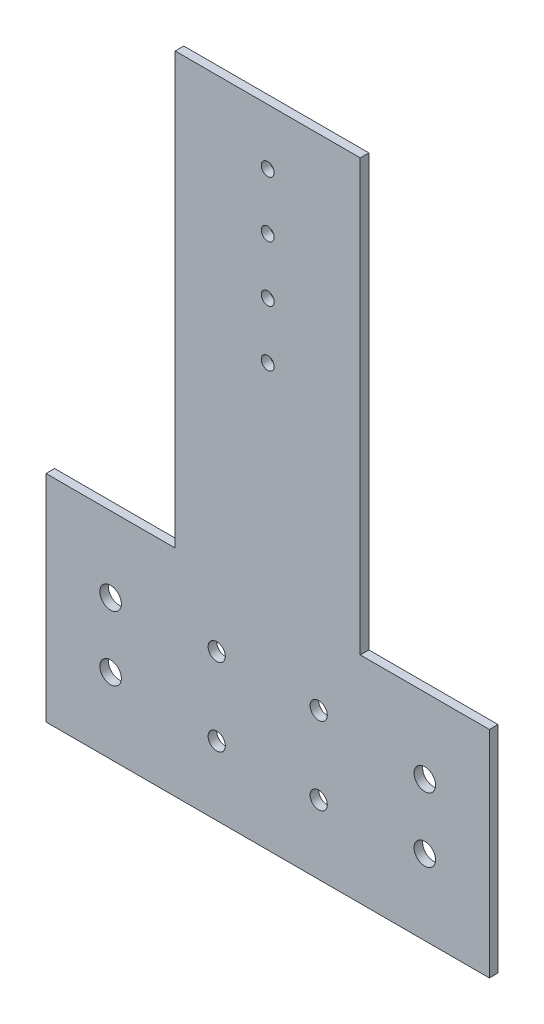
ISO-10303-21;
HEADER;
FILE_DESCRIPTION(('STEP AP214'),'2;1');
FILE_NAME('part.step','',(''),(''),'','','');
FILE_SCHEMA(('AUTOMOTIVE_DESIGN { 1 0 10303 214 1 1 1 1 }'));
ENDSEC;
DATA;
#1=APPLICATION_CONTEXT('core data for automotive mechanical design processes');
#2=APPLICATION_PROTOCOL_DEFINITION('international standard','automotive_design',2000,#1);
#3=PRODUCT_CONTEXT('',#1,'mechanical');
#4=PRODUCT('Part','Part','',(#3));
#5=PRODUCT_RELATED_PRODUCT_CATEGORY('part','',(#4));
#6=PRODUCT_DEFINITION_FORMATION('','',#4);
#7=PRODUCT_DEFINITION_CONTEXT('part definition',#1,'design');
#8=PRODUCT_DEFINITION('design','',#6,#7);
#9=PRODUCT_DEFINITION_SHAPE('','',#8);
#10=(LENGTH_UNIT() NAMED_UNIT(*) SI_UNIT(.MILLI.,.METRE.));
#11=(NAMED_UNIT(*) PLANE_ANGLE_UNIT() SI_UNIT($,.RADIAN.));
#12=(NAMED_UNIT(*) SI_UNIT($,.STERADIAN.) SOLID_ANGLE_UNIT());
#13=UNCERTAINTY_MEASURE_WITH_UNIT(LENGTH_MEASURE(1.E-05),#10,'distance_accuracy_value','');
#14=(GEOMETRIC_REPRESENTATION_CONTEXT(3) GLOBAL_UNCERTAINTY_ASSIGNED_CONTEXT((#13)) GLOBAL_UNIT_ASSIGNED_CONTEXT((#10,
#11,#12)) REPRESENTATION_CONTEXT('',''));
#15=CARTESIAN_POINT('',(0.,0.,0.));
#16=DIRECTION('',(0.,0.,1.));
#17=DIRECTION('',(1.,0.,0.));
#18=AXIS2_PLACEMENT_3D('',#15,#16,#17);
#19=CARTESIAN_POINT('',(-51.5,25.,2.));
#20=DIRECTION('',(0.,-1.,0.));
#21=DIRECTION('',(0.,0.,-1.));
#22=AXIS2_PLACEMENT_3D('',#19,#20,#21);
#23=PLANE('',#22);
#24=DIRECTION('',(0.,0.,1.));
#25=VECTOR('',#24,1.);
#26=CARTESIAN_POINT('',(-21.5,25.,2.));
#27=LINE('',#26,#25);
#28=CARTESIAN_POINT('',(-21.5,25.,0.));
#29=VERTEX_POINT('',#28);
#30=CARTESIAN_POINT('',(-21.5,25.,2.));
#31=VERTEX_POINT('',#30);
#32=EDGE_CURVE('E126',#29,#31,#27,.T.);
#33=ORIENTED_EDGE('',*,*,#32,.F.);
#34=DIRECTION('',(-1.,0.,0.));
#35=VECTOR('',#34,1.);
#36=CARTESIAN_POINT('',(-51.5,25.,0.));
#37=LINE('',#36,#35);
#38=CARTESIAN_POINT('',(-51.5,25.,0.));
#39=VERTEX_POINT('',#38);
#40=EDGE_CURVE('E172',#29,#39,#37,.T.);
#41=ORIENTED_EDGE('',*,*,#40,.T.);
#42=DIRECTION('',(0.,0.,-1.));
#43=VECTOR('',#42,1.);
#44=CARTESIAN_POINT('',(-51.5,25.,2.));
#45=LINE('',#44,#43);
#46=CARTESIAN_POINT('',(-51.5,25.,2.));
#47=VERTEX_POINT('',#46);
#48=EDGE_CURVE('E46',#47,#39,#45,.T.);
#49=ORIENTED_EDGE('',*,*,#48,.F.);
#50=DIRECTION('',(-1.,0.,0.));
#51=VECTOR('',#50,1.);
#52=CARTESIAN_POINT('',(-51.5,25.,2.));
#53=LINE('',#52,#51);
#54=EDGE_CURVE('E54',#31,#47,#53,.T.);
#55=ORIENTED_EDGE('',*,*,#54,.F.);
#56=EDGE_LOOP('',(#33,#41,#49,#55));
#57=FACE_BOUND('',#56,.T.);
#58=ADVANCED_FACE('F37',(#57),#23,.F.);
#59=DIRECTION('',(0.,0.,-1.));
#60=VECTOR('',#59,1.);
#61=CARTESIAN_POINT('',(21.5,25.,2.));
#62=LINE('',#61,#60);
#63=CARTESIAN_POINT('',(21.5,25.,2.));
#64=VERTEX_POINT('',#63);
#65=CARTESIAN_POINT('',(21.5,25.,0.));
#66=VERTEX_POINT('',#65);
#67=EDGE_CURVE('E62',#64,#66,#62,.T.);
#68=ORIENTED_EDGE('',*,*,#67,.F.);
#69=CARTESIAN_POINT('',(51.5,25.,2.));
#70=VERTEX_POINT('',#69);
#71=EDGE_CURVE('E162',#70,#64,#53,.T.);
#72=ORIENTED_EDGE('',*,*,#71,.F.);
#73=DIRECTION('',(0.,0.,-1.));
#74=VECTOR('',#73,1.);
#75=CARTESIAN_POINT('',(51.5,25.,2.));
#76=LINE('',#75,#74);
#77=CARTESIAN_POINT('',(51.5,25.,0.));
#78=VERTEX_POINT('',#77);
#79=EDGE_CURVE('E11',#70,#78,#76,.T.);
#80=ORIENTED_EDGE('',*,*,#79,.T.);
#81=EDGE_CURVE('E174',#78,#66,#37,.T.);
#82=ORIENTED_EDGE('',*,*,#81,.T.);
#83=EDGE_LOOP('',(#68,#72,#80,#82));
#84=FACE_BOUND('',#83,.T.);
#85=ADVANCED_FACE('F289',(#84),#23,.F.);
#86=CARTESIAN_POINT('',(51.5,-25.,2.));
#87=DIRECTION('',(-1.,0.,0.));
#88=DIRECTION('',(0.,0.,1.));
#89=AXIS2_PLACEMENT_3D('',#86,#87,#88);
#90=PLANE('',#89);
#91=DIRECTION('',(0.,1.,0.));
#92=VECTOR('',#91,1.);
#93=CARTESIAN_POINT('',(51.5,-25.,0.));
#94=LINE('',#93,#92);
#95=CARTESIAN_POINT('',(51.5,-25.,0.));
#96=VERTEX_POINT('',#95);
#97=EDGE_CURVE('E169',#96,#78,#94,.T.);
#98=ORIENTED_EDGE('',*,*,#97,.T.);
#99=ORIENTED_EDGE('',*,*,#79,.F.);
#100=DIRECTION('',(0.,1.,0.));
#101=VECTOR('',#100,1.);
#102=CARTESIAN_POINT('',(51.5,-25.,2.));
#103=LINE('',#102,#101);
#104=CARTESIAN_POINT('',(51.5,-25.,2.));
#105=VERTEX_POINT('',#104);
#106=EDGE_CURVE('E159',#105,#70,#103,.T.);
#107=ORIENTED_EDGE('',*,*,#106,.F.);
#108=DIRECTION('',(0.,0.,-1.));
#109=VECTOR('',#108,1.);
#110=CARTESIAN_POINT('',(51.5,-25.,2.));
#111=LINE('',#110,#109);
#112=EDGE_CURVE('E168',#105,#96,#111,.T.);
#113=ORIENTED_EDGE('',*,*,#112,.T.);
#114=EDGE_LOOP('',(#98,#99,#107,#113));
#115=FACE_BOUND('',#114,.T.);
#116=ADVANCED_FACE('F39',(#115),#90,.F.);
#117=CARTESIAN_POINT('',(-51.5,-25.,2.));
#118=DIRECTION('',(1.,0.,0.));
#119=DIRECTION('',(0.,0.,-1.));
#120=AXIS2_PLACEMENT_3D('',#117,#118,#119);
#121=PLANE('',#120);
#122=DIRECTION('',(0.,-1.,0.));
#123=VECTOR('',#122,1.);
#124=CARTESIAN_POINT('',(-51.5,-25.,0.));
#125=LINE('',#124,#123);
#126=CARTESIAN_POINT('',(-51.5,-25.,0.));
#127=VERTEX_POINT('',#126);
#128=EDGE_CURVE('E176',#39,#127,#125,.T.);
#129=ORIENTED_EDGE('',*,*,#128,.T.);
#130=DIRECTION('',(0.,0.,-1.));
#131=VECTOR('',#130,1.);
#132=CARTESIAN_POINT('',(-51.5,-25.,2.));
#133=LINE('',#132,#131);
#134=CARTESIAN_POINT('',(-51.5,-25.,2.));
#135=VERTEX_POINT('',#134);
#136=EDGE_CURVE('E181',#135,#127,#133,.T.);
#137=ORIENTED_EDGE('',*,*,#136,.F.);
#138=DIRECTION('',(0.,-1.,0.));
#139=VECTOR('',#138,1.);
#140=CARTESIAN_POINT('',(-51.5,-25.,2.));
#141=LINE('',#140,#139);
#142=EDGE_CURVE('E164',#47,#135,#141,.T.);
#143=ORIENTED_EDGE('',*,*,#142,.F.);
#144=ORIENTED_EDGE('',*,*,#48,.T.);
#145=EDGE_LOOP('',(#129,#137,#143,#144));
#146=FACE_BOUND('',#145,.T.);
#147=ADVANCED_FACE('F294',(#146),#121,.F.);
#148=CARTESIAN_POINT('',(-51.5,-25.,2.));
#149=DIRECTION('',(0.,1.,0.));
#150=DIRECTION('',(0.,0.,1.));
#151=AXIS2_PLACEMENT_3D('',#148,#149,#150);
#152=PLANE('',#151);
#153=DIRECTION('',(1.,0.,0.));
#154=VECTOR('',#153,1.);
#155=CARTESIAN_POINT('',(-51.5,-25.,0.));
#156=LINE('',#155,#154);
#157=EDGE_CURVE('E161',#127,#96,#156,.T.);
#158=ORIENTED_EDGE('',*,*,#157,.T.);
#159=ORIENTED_EDGE('',*,*,#112,.F.);
#160=DIRECTION('',(1.,0.,0.));
#161=VECTOR('',#160,1.);
#162=CARTESIAN_POINT('',(-51.5,-25.,2.));
#163=LINE('',#162,#161);
#164=EDGE_CURVE('E166',#135,#105,#163,.T.);
#165=ORIENTED_EDGE('',*,*,#164,.F.);
#166=ORIENTED_EDGE('',*,*,#136,.T.);
#167=EDGE_LOOP('',(#158,#159,#165,#166));
#168=FACE_BOUND('',#167,.T.);
#169=ADVANCED_FACE('F249',(#168),#152,.F.);
#170=CARTESIAN_POINT('',(0.,0.,2.));
#171=DIRECTION('',(0.,0.,-1.));
#172=DIRECTION('',(-1.,0.,0.));
#173=AXIS2_PLACEMENT_3D('',#170,#171,#172);
#174=PLANE('',#173);
#175=CARTESIAN_POINT('',(0.,112.,2.));
#176=DIRECTION('',(0.,0.,1.));
#177=DIRECTION('',(1.,0.,0.));
#178=AXIS2_PLACEMENT_3D('',#175,#176,#177);
#179=CIRCLE('',#178,1.5);
#180=CARTESIAN_POINT('',(1.5,112.,2.));
#181=VERTEX_POINT('',#180);
#182=EDGE_CURVE('E210',#181,#181,#179,.T.);
#183=ORIENTED_EDGE('',*,*,#182,.F.);
#184=EDGE_LOOP('',(#183));
#185=FACE_BOUND('',#184,.T.);
#186=CARTESIAN_POINT('',(0.,99.,2.));
#187=DIRECTION('',(0.,0.,1.));
#188=DIRECTION('',(1.,0.,0.));
#189=AXIS2_PLACEMENT_3D('',#186,#187,#188);
#190=CIRCLE('',#189,1.5);
#191=CARTESIAN_POINT('',(1.50000000000001,99.,2.));
#192=VERTEX_POINT('',#191);
#193=EDGE_CURVE('E239',#192,#192,#190,.T.);
#194=ORIENTED_EDGE('',*,*,#193,.F.);
#195=EDGE_LOOP('',(#194));
#196=FACE_BOUND('',#195,.T.);
#197=CARTESIAN_POINT('',(0.,86.,2.));
#198=DIRECTION('',(0.,0.,1.));
#199=DIRECTION('',(1.,0.,0.));
#200=AXIS2_PLACEMENT_3D('',#197,#198,#199);
#201=CIRCLE('',#200,1.5);
#202=CARTESIAN_POINT('',(1.50000000000001,86.,2.));
#203=VERTEX_POINT('',#202);
#204=EDGE_CURVE('E236',#203,#203,#201,.T.);
#205=ORIENTED_EDGE('',*,*,#204,.F.);
#206=EDGE_LOOP('',(#205));
#207=FACE_BOUND('',#206,.T.);
#208=CARTESIAN_POINT('',(0.,73.,2.));
#209=DIRECTION('',(0.,0.,1.));
#210=DIRECTION('',(1.,0.,0.));
#211=AXIS2_PLACEMENT_3D('',#208,#209,#210);
#212=CIRCLE('',#211,1.5);
#213=CARTESIAN_POINT('',(1.50000000000001,73.,2.));
#214=VERTEX_POINT('',#213);
#215=EDGE_CURVE('E233',#214,#214,#212,.T.);
#216=ORIENTED_EDGE('',*,*,#215,.F.);
#217=EDGE_LOOP('',(#216));
#218=FACE_BOUND('',#217,.T.);
#219=CARTESIAN_POINT('',(36.5,7.49999999999999,2.));
#220=DIRECTION('',(0.,0.,1.));
#221=DIRECTION('',(-1.,0.,0.));
#222=AXIS2_PLACEMENT_3D('',#219,#220,#221);
#223=CIRCLE('',#222,2.5);
#224=CARTESIAN_POINT('',(34.,7.49999999999999,2.));
#225=VERTEX_POINT('',#224);
#226=EDGE_CURVE('E127',#225,#225,#223,.T.);
#227=ORIENTED_EDGE('',*,*,#226,.F.);
#228=EDGE_LOOP('',(#227));
#229=FACE_BOUND('',#228,.T.);
#230=CARTESIAN_POINT('',(36.5,-7.5,2.));
#231=DIRECTION('',(0.,0.,1.));
#232=DIRECTION('',(-1.,0.,0.));
#233=AXIS2_PLACEMENT_3D('',#230,#231,#232);
#234=CIRCLE('',#233,2.5);
#235=CARTESIAN_POINT('',(34.,-7.5,2.));
#236=VERTEX_POINT('',#235);
#237=EDGE_CURVE('E130',#236,#236,#234,.T.);
#238=ORIENTED_EDGE('',*,*,#237,.F.);
#239=EDGE_LOOP('',(#238));
#240=FACE_BOUND('',#239,.T.);
#241=CARTESIAN_POINT('',(-36.5,-7.5,2.));
#242=DIRECTION('',(0.,0.,1.));
#243=DIRECTION('',(1.,0.,0.));
#244=AXIS2_PLACEMENT_3D('',#241,#242,#243);
#245=CIRCLE('',#244,2.5);
#246=CARTESIAN_POINT('',(-34.,-7.5,2.));
#247=VERTEX_POINT('',#246);
#248=EDGE_CURVE('E136',#247,#247,#245,.T.);
#249=ORIENTED_EDGE('',*,*,#248,.F.);
#250=EDGE_LOOP('',(#249));
#251=FACE_BOUND('',#250,.T.);
#252=CARTESIAN_POINT('',(-36.5,7.5,2.));
#253=DIRECTION('',(0.,0.,1.));
#254=DIRECTION('',(1.,0.,0.));
#255=AXIS2_PLACEMENT_3D('',#252,#253,#254);
#256=CIRCLE('',#255,2.5);
#257=CARTESIAN_POINT('',(-34.,7.5,2.));
#258=VERTEX_POINT('',#257);
#259=EDGE_CURVE('E139',#258,#258,#256,.T.);
#260=ORIENTED_EDGE('',*,*,#259,.F.);
#261=EDGE_LOOP('',(#260));
#262=FACE_BOUND('',#261,.T.);
#263=CARTESIAN_POINT('',(11.845,9.,2.));
#264=DIRECTION('',(0.,0.,1.));
#265=DIRECTION('',(1.,0.,0.));
#266=AXIS2_PLACEMENT_3D('',#263,#264,#265);
#267=CIRCLE('',#266,2.);
#268=CARTESIAN_POINT('',(13.845,9.,2.));
#269=VERTEX_POINT('',#268);
#270=EDGE_CURVE('E152',#269,#269,#267,.T.);
#271=ORIENTED_EDGE('',*,*,#270,.F.);
#272=EDGE_LOOP('',(#271));
#273=FACE_BOUND('',#272,.T.);
#274=CARTESIAN_POINT('',(11.845,-9.,2.));
#275=DIRECTION('',(0.,0.,1.));
#276=DIRECTION('',(1.,0.,0.));
#277=AXIS2_PLACEMENT_3D('',#274,#275,#276);
#278=CIRCLE('',#277,2.);
#279=CARTESIAN_POINT('',(13.845,-9.,2.));
#280=VERTEX_POINT('',#279);
#281=EDGE_CURVE('E149',#280,#280,#278,.T.);
#282=ORIENTED_EDGE('',*,*,#281,.F.);
#283=EDGE_LOOP('',(#282));
#284=FACE_BOUND('',#283,.T.);
#285=CARTESIAN_POINT('',(-11.845,-9.,2.));
#286=DIRECTION('',(0.,0.,1.));
#287=DIRECTION('',(1.,0.,0.));
#288=AXIS2_PLACEMENT_3D('',#285,#286,#287);
#289=CIRCLE('',#288,2.);
#290=CARTESIAN_POINT('',(-9.845,-9.,2.));
#291=VERTEX_POINT('',#290);
#292=EDGE_CURVE('E145',#291,#291,#289,.T.);
#293=ORIENTED_EDGE('',*,*,#292,.F.);
#294=EDGE_LOOP('',(#293));
#295=FACE_BOUND('',#294,.T.);
#296=CARTESIAN_POINT('',(-11.845,9.,2.));
#297=DIRECTION('',(0.,0.,1.));
#298=DIRECTION('',(1.,0.,0.));
#299=AXIS2_PLACEMENT_3D('',#296,#297,#298);
#300=CIRCLE('',#299,2.);
#301=CARTESIAN_POINT('',(-9.845,9.,2.));
#302=VERTEX_POINT('',#301);
#303=EDGE_CURVE('E148',#302,#302,#300,.T.);
#304=ORIENTED_EDGE('',*,*,#303,.F.);
#305=EDGE_LOOP('',(#304));
#306=FACE_BOUND('',#305,.T.);
#307=ORIENTED_EDGE('',*,*,#106,.T.);
#308=ORIENTED_EDGE('',*,*,#71,.T.);
#309=DIRECTION('',(0.,-1.,0.));
#310=VECTOR('',#309,1.);
#311=CARTESIAN_POINT('',(21.5,125.,2.));
#312=LINE('',#311,#310);
#313=CARTESIAN_POINT('',(21.5,125.,2.));
#314=VERTEX_POINT('',#313);
#315=EDGE_CURVE('E111',#314,#64,#312,.T.);
#316=ORIENTED_EDGE('',*,*,#315,.F.);
#317=DIRECTION('',(1.,0.,0.));
#318=VECTOR('',#317,1.);
#319=CARTESIAN_POINT('',(-21.5,125.,2.));
#320=LINE('',#319,#318);
#321=CARTESIAN_POINT('',(-21.5,125.,2.));
#322=VERTEX_POINT('',#321);
#323=EDGE_CURVE('E103',#322,#314,#320,.T.);
#324=ORIENTED_EDGE('',*,*,#323,.F.);
#325=DIRECTION('',(0.,-1.,0.));
#326=VECTOR('',#325,1.);
#327=CARTESIAN_POINT('',(-21.5,125.,2.));
#328=LINE('',#327,#326);
#329=EDGE_CURVE('E108',#322,#31,#328,.T.);
#330=ORIENTED_EDGE('',*,*,#329,.T.);
#331=ORIENTED_EDGE('',*,*,#54,.T.);
#332=ORIENTED_EDGE('',*,*,#142,.T.);
#333=ORIENTED_EDGE('',*,*,#164,.T.);
#334=EDGE_LOOP('',(#307,#308,#316,#324,#330,#331,#332,#333));
#335=FACE_BOUND('',#334,.T.);
#336=ADVANCED_FACE('F106',(#185,#196,#207,#218,#229,#240,#251,#262,#273,#284,#295,#306,#335),
#174,.F.);
#337=CARTESIAN_POINT('',(0.,0.,0.));
#338=DIRECTION('',(0.,0.,-1.));
#339=DIRECTION('',(-1.,0.,0.));
#340=AXIS2_PLACEMENT_3D('',#337,#338,#339);
#341=PLANE('',#340);
#342=CARTESIAN_POINT('',(0.,112.,0.));
#343=DIRECTION('',(0.,0.,-1.));
#344=DIRECTION('',(-1.,0.,0.));
#345=AXIS2_PLACEMENT_3D('',#342,#343,#344);
#346=CIRCLE('',#345,1.5);
#347=CARTESIAN_POINT('',(-1.5,112.,0.));
#348=VERTEX_POINT('',#347);
#349=EDGE_CURVE('E41',#348,#348,#346,.T.);
#350=ORIENTED_EDGE('',*,*,#349,.F.);
#351=EDGE_LOOP('',(#350));
#352=FACE_BOUND('',#351,.T.);
#353=CARTESIAN_POINT('',(0.,99.,0.));
#354=DIRECTION('',(0.,0.,-1.));
#355=DIRECTION('',(-1.,0.,0.));
#356=AXIS2_PLACEMENT_3D('',#353,#354,#355);
#357=CIRCLE('',#356,1.5);
#358=CARTESIAN_POINT('',(-1.5,99.,0.));
#359=VERTEX_POINT('',#358);
#360=EDGE_CURVE('E212',#359,#359,#357,.T.);
#361=ORIENTED_EDGE('',*,*,#360,.F.);
#362=EDGE_LOOP('',(#361));
#363=FACE_BOUND('',#362,.T.);
#364=CARTESIAN_POINT('',(0.,86.,0.));
#365=DIRECTION('',(0.,0.,-1.));
#366=DIRECTION('',(-1.,0.,0.));
#367=AXIS2_PLACEMENT_3D('',#364,#365,#366);
#368=CIRCLE('',#367,1.5);
#369=CARTESIAN_POINT('',(-1.5,86.,0.));
#370=VERTEX_POINT('',#369);
#371=EDGE_CURVE('E209',#370,#370,#368,.T.);
#372=ORIENTED_EDGE('',*,*,#371,.F.);
#373=EDGE_LOOP('',(#372));
#374=FACE_BOUND('',#373,.T.);
#375=CARTESIAN_POINT('',(0.,73.,0.));
#376=DIRECTION('',(0.,0.,-1.));
#377=DIRECTION('',(-1.,0.,0.));
#378=AXIS2_PLACEMENT_3D('',#375,#376,#377);
#379=CIRCLE('',#378,1.5);
#380=CARTESIAN_POINT('',(-1.5,73.,0.));
#381=VERTEX_POINT('',#380);
#382=EDGE_CURVE('E206',#381,#381,#379,.T.);
#383=ORIENTED_EDGE('',*,*,#382,.F.);
#384=EDGE_LOOP('',(#383));
#385=FACE_BOUND('',#384,.T.);
#386=CARTESIAN_POINT('',(36.5,7.49999999999999,0.));
#387=DIRECTION('',(0.,0.,-1.));
#388=DIRECTION('',(-1.,0.,0.));
#389=AXIS2_PLACEMENT_3D('',#386,#387,#388);
#390=CIRCLE('',#389,2.5);
#391=CARTESIAN_POINT('',(34.,7.49999999999999,0.));
#392=VERTEX_POINT('',#391);
#393=EDGE_CURVE('E155',#392,#392,#390,.T.);
#394=ORIENTED_EDGE('',*,*,#393,.F.);
#395=EDGE_LOOP('',(#394));
#396=FACE_BOUND('',#395,.T.);
#397=CARTESIAN_POINT('',(36.5,-7.5,0.));
#398=DIRECTION('',(0.,0.,-1.));
#399=DIRECTION('',(-1.,0.,0.));
#400=AXIS2_PLACEMENT_3D('',#397,#398,#399);
#401=CIRCLE('',#400,2.5);
#402=CARTESIAN_POINT('',(34.,-7.5,0.));
#403=VERTEX_POINT('',#402);
#404=EDGE_CURVE('E201',#403,#403,#401,.T.);
#405=ORIENTED_EDGE('',*,*,#404,.F.);
#406=EDGE_LOOP('',(#405));
#407=FACE_BOUND('',#406,.T.);
#408=CARTESIAN_POINT('',(-36.5,-7.5,0.));
#409=DIRECTION('',(0.,0.,-1.));
#410=DIRECTION('',(-1.,0.,0.));
#411=AXIS2_PLACEMENT_3D('',#408,#409,#410);
#412=CIRCLE('',#411,2.5);
#413=CARTESIAN_POINT('',(-39.,-7.5,0.));
#414=VERTEX_POINT('',#413);
#415=EDGE_CURVE('E198',#414,#414,#412,.T.);
#416=ORIENTED_EDGE('',*,*,#415,.F.);
#417=EDGE_LOOP('',(#416));
#418=FACE_BOUND('',#417,.T.);
#419=CARTESIAN_POINT('',(-36.5,7.5,0.));
#420=DIRECTION('',(0.,0.,-1.));
#421=DIRECTION('',(-1.,0.,0.));
#422=AXIS2_PLACEMENT_3D('',#419,#420,#421);
#423=CIRCLE('',#422,2.5);
#424=CARTESIAN_POINT('',(-39.,7.5,0.));
#425=VERTEX_POINT('',#424);
#426=EDGE_CURVE('E144',#425,#425,#423,.T.);
#427=ORIENTED_EDGE('',*,*,#426,.F.);
#428=EDGE_LOOP('',(#427));
#429=FACE_BOUND('',#428,.T.);
#430=CARTESIAN_POINT('',(11.845,9.,0.));
#431=DIRECTION('',(0.,0.,-1.));
#432=DIRECTION('',(-1.,0.,0.));
#433=AXIS2_PLACEMENT_3D('',#430,#431,#432);
#434=CIRCLE('',#433,2.);
#435=CARTESIAN_POINT('',(9.845,9.,0.));
#436=VERTEX_POINT('',#435);
#437=EDGE_CURVE('E173',#436,#436,#434,.T.);
#438=ORIENTED_EDGE('',*,*,#437,.F.);
#439=EDGE_LOOP('',(#438));
#440=FACE_BOUND('',#439,.T.);
#441=CARTESIAN_POINT('',(11.845,-9.,0.));
#442=DIRECTION('',(0.,0.,-1.));
#443=DIRECTION('',(-1.,0.,0.));
#444=AXIS2_PLACEMENT_3D('',#441,#442,#443);
#445=CIRCLE('',#444,2.);
#446=CARTESIAN_POINT('',(9.845,-9.,0.));
#447=VERTEX_POINT('',#446);
#448=EDGE_CURVE('E191',#447,#447,#445,.T.);
#449=ORIENTED_EDGE('',*,*,#448,.F.);
#450=EDGE_LOOP('',(#449));
#451=FACE_BOUND('',#450,.T.);
#452=CARTESIAN_POINT('',(-11.845,-9.,0.));
#453=DIRECTION('',(0.,0.,-1.));
#454=DIRECTION('',(-1.,0.,0.));
#455=AXIS2_PLACEMENT_3D('',#452,#453,#454);
#456=CIRCLE('',#455,2.);
#457=CARTESIAN_POINT('',(-13.845,-9.,0.));
#458=VERTEX_POINT('',#457);
#459=EDGE_CURVE('E188',#458,#458,#456,.T.);
#460=ORIENTED_EDGE('',*,*,#459,.F.);
#461=EDGE_LOOP('',(#460));
#462=FACE_BOUND('',#461,.T.);
#463=CARTESIAN_POINT('',(-11.845,9.,0.));
#464=DIRECTION('',(0.,0.,-1.));
#465=DIRECTION('',(-1.,0.,0.));
#466=AXIS2_PLACEMENT_3D('',#463,#464,#465);
#467=CIRCLE('',#466,2.);
#468=CARTESIAN_POINT('',(-13.845,9.,0.));
#469=VERTEX_POINT('',#468);
#470=EDGE_CURVE('E158',#469,#469,#467,.T.);
#471=ORIENTED_EDGE('',*,*,#470,.F.);
#472=EDGE_LOOP('',(#471));
#473=FACE_BOUND('',#472,.T.);
#474=ORIENTED_EDGE('',*,*,#97,.F.);
#475=ORIENTED_EDGE('',*,*,#157,.F.);
#476=ORIENTED_EDGE('',*,*,#128,.F.);
#477=ORIENTED_EDGE('',*,*,#40,.F.);
#478=DIRECTION('',(0.,-1.,0.));
#479=VECTOR('',#478,1.);
#480=CARTESIAN_POINT('',(-21.5,125.,0.));
#481=LINE('',#480,#479);
#482=CARTESIAN_POINT('',(-21.5,125.,0.));
#483=VERTEX_POINT('',#482);
#484=EDGE_CURVE('E224',#483,#29,#481,.T.);
#485=ORIENTED_EDGE('',*,*,#484,.F.);
#486=DIRECTION('',(-1.,0.,0.));
#487=VECTOR('',#486,1.);
#488=CARTESIAN_POINT('',(-21.5,125.,0.));
#489=LINE('',#488,#487);
#490=CARTESIAN_POINT('',(21.5,125.,0.));
#491=VERTEX_POINT('',#490);
#492=EDGE_CURVE('E120',#491,#483,#489,.T.);
#493=ORIENTED_EDGE('',*,*,#492,.F.);
#494=DIRECTION('',(0.,-1.,0.));
#495=VECTOR('',#494,1.);
#496=CARTESIAN_POINT('',(21.5,125.,0.));
#497=LINE('',#496,#495);
#498=EDGE_CURVE('E132',#491,#66,#497,.T.);
#499=ORIENTED_EDGE('',*,*,#498,.T.);
#500=ORIENTED_EDGE('',*,*,#81,.F.);
#501=EDGE_LOOP('',(#474,#475,#476,#477,#485,#493,#499,#500));
#502=FACE_BOUND('',#501,.T.);
#503=ADVANCED_FACE('F229',(#352,#363,#374,#385,#396,#407,#418,#429,#440,#451,#462,#473,#502),
#341,.T.);
#504=CARTESIAN_POINT('',(-11.845,9.,-5.));
#505=DIRECTION('',(0.,0.,1.));
#506=DIRECTION('',(1.,0.,0.));
#507=AXIS2_PLACEMENT_3D('',#504,#505,#506);
#508=CYLINDRICAL_SURFACE('',#507,2.);
#509=ORIENTED_EDGE('',*,*,#470,.T.);
#510=EDGE_LOOP('',(#509));
#511=FACE_BOUND('',#510,.T.);
#512=ORIENTED_EDGE('',*,*,#303,.T.);
#513=EDGE_LOOP('',(#512));
#514=FACE_BOUND('',#513,.T.);
#515=ADVANCED_FACE('F273',(#511,#514),#508,.F.);
#516=CARTESIAN_POINT('',(-11.845,-9.,-5.));
#517=DIRECTION('',(0.,0.,1.));
#518=DIRECTION('',(1.,0.,0.));
#519=AXIS2_PLACEMENT_3D('',#516,#517,#518);
#520=CYLINDRICAL_SURFACE('',#519,2.);
#521=ORIENTED_EDGE('',*,*,#459,.T.);
#522=EDGE_LOOP('',(#521));
#523=FACE_BOUND('',#522,.T.);
#524=ORIENTED_EDGE('',*,*,#292,.T.);
#525=EDGE_LOOP('',(#524));
#526=FACE_BOUND('',#525,.T.);
#527=ADVANCED_FACE('F275',(#523,#526),#520,.F.);
#528=CARTESIAN_POINT('',(11.845,-9.,-5.));
#529=DIRECTION('',(0.,0.,1.));
#530=DIRECTION('',(1.,0.,0.));
#531=AXIS2_PLACEMENT_3D('',#528,#529,#530);
#532=CYLINDRICAL_SURFACE('',#531,2.);
#533=ORIENTED_EDGE('',*,*,#448,.T.);
#534=EDGE_LOOP('',(#533));
#535=FACE_BOUND('',#534,.T.);
#536=ORIENTED_EDGE('',*,*,#281,.T.);
#537=EDGE_LOOP('',(#536));
#538=FACE_BOUND('',#537,.T.);
#539=ADVANCED_FACE('F282',(#535,#538),#532,.F.);
#540=CARTESIAN_POINT('',(11.845,9.,-5.));
#541=DIRECTION('',(0.,0.,1.));
#542=DIRECTION('',(1.,0.,0.));
#543=AXIS2_PLACEMENT_3D('',#540,#541,#542);
#544=CYLINDRICAL_SURFACE('',#543,2.);
#545=ORIENTED_EDGE('',*,*,#437,.T.);
#546=EDGE_LOOP('',(#545));
#547=FACE_BOUND('',#546,.T.);
#548=ORIENTED_EDGE('',*,*,#270,.T.);
#549=EDGE_LOOP('',(#548));
#550=FACE_BOUND('',#549,.T.);
#551=ADVANCED_FACE('F350',(#547,#550),#544,.F.);
#552=CARTESIAN_POINT('',(-36.5,7.5,-5.));
#553=DIRECTION('',(0.,0.,1.));
#554=DIRECTION('',(1.,0.,0.));
#555=AXIS2_PLACEMENT_3D('',#552,#553,#554);
#556=CYLINDRICAL_SURFACE('',#555,2.5);
#557=ORIENTED_EDGE('',*,*,#426,.T.);
#558=EDGE_LOOP('',(#557));
#559=FACE_BOUND('',#558,.T.);
#560=ORIENTED_EDGE('',*,*,#259,.T.);
#561=EDGE_LOOP('',(#560));
#562=FACE_BOUND('',#561,.T.);
#563=ADVANCED_FACE('F361',(#559,#562),#556,.F.);
#564=CARTESIAN_POINT('',(-36.5,-7.5,-5.));
#565=DIRECTION('',(0.,0.,1.));
#566=DIRECTION('',(1.,0.,0.));
#567=AXIS2_PLACEMENT_3D('',#564,#565,#566);
#568=CYLINDRICAL_SURFACE('',#567,2.5);
#569=ORIENTED_EDGE('',*,*,#415,.T.);
#570=EDGE_LOOP('',(#569));
#571=FACE_BOUND('',#570,.T.);
#572=ORIENTED_EDGE('',*,*,#248,.T.);
#573=EDGE_LOOP('',(#572));
#574=FACE_BOUND('',#573,.T.);
#575=ADVANCED_FACE('F371',(#571,#574),#568,.F.);
#576=CARTESIAN_POINT('',(36.5,-7.5,-5.));
#577=DIRECTION('',(0.,0.,1.));
#578=DIRECTION('',(1.,0.,0.));
#579=AXIS2_PLACEMENT_3D('',#576,#577,#578);
#580=CYLINDRICAL_SURFACE('',#579,2.5);
#581=ORIENTED_EDGE('',*,*,#404,.T.);
#582=EDGE_LOOP('',(#581));
#583=FACE_BOUND('',#582,.T.);
#584=ORIENTED_EDGE('',*,*,#237,.T.);
#585=EDGE_LOOP('',(#584));
#586=FACE_BOUND('',#585,.T.);
#587=ADVANCED_FACE('F382',(#583,#586),#580,.F.);
#588=CARTESIAN_POINT('',(36.5,7.49999999999999,-5.));
#589=DIRECTION('',(0.,0.,1.));
#590=DIRECTION('',(1.,0.,0.));
#591=AXIS2_PLACEMENT_3D('',#588,#589,#590);
#592=CYLINDRICAL_SURFACE('',#591,2.5);
#593=ORIENTED_EDGE('',*,*,#393,.T.);
#594=EDGE_LOOP('',(#593));
#595=FACE_BOUND('',#594,.T.);
#596=ORIENTED_EDGE('',*,*,#226,.T.);
#597=EDGE_LOOP('',(#596));
#598=FACE_BOUND('',#597,.T.);
#599=ADVANCED_FACE('F393',(#595,#598),#592,.F.);
#600=CARTESIAN_POINT('',(-21.5,125.,2.));
#601=DIRECTION('',(1.,0.,0.));
#602=DIRECTION('',(0.,0.,-1.));
#603=AXIS2_PLACEMENT_3D('',#600,#601,#602);
#604=PLANE('',#603);
#605=ORIENTED_EDGE('',*,*,#32,.T.);
#606=ORIENTED_EDGE('',*,*,#329,.F.);
#607=DIRECTION('',(0.,0.,1.));
#608=VECTOR('',#607,1.);
#609=CARTESIAN_POINT('',(-21.5,125.,2.));
#610=LINE('',#609,#608);
#611=EDGE_CURVE('E115',#483,#322,#610,.T.);
#612=ORIENTED_EDGE('',*,*,#611,.F.);
#613=ORIENTED_EDGE('',*,*,#484,.T.);
#614=EDGE_LOOP('',(#605,#606,#612,#613));
#615=FACE_BOUND('',#614,.T.);
#616=ADVANCED_FACE('F125',(#615),#604,.F.);
#617=CARTESIAN_POINT('',(21.5,125.,2.));
#618=DIRECTION('',(-1.,0.,0.));
#619=DIRECTION('',(0.,0.,1.));
#620=AXIS2_PLACEMENT_3D('',#617,#618,#619);
#621=PLANE('',#620);
#622=ORIENTED_EDGE('',*,*,#67,.T.);
#623=ORIENTED_EDGE('',*,*,#498,.F.);
#624=DIRECTION('',(0.,0.,-1.));
#625=VECTOR('',#624,1.);
#626=CARTESIAN_POINT('',(21.5,125.,2.));
#627=LINE('',#626,#625);
#628=EDGE_CURVE('E114',#314,#491,#627,.T.);
#629=ORIENTED_EDGE('',*,*,#628,.F.);
#630=ORIENTED_EDGE('',*,*,#315,.T.);
#631=EDGE_LOOP('',(#622,#623,#629,#630));
#632=FACE_BOUND('',#631,.T.);
#633=ADVANCED_FACE('F231',(#632),#621,.F.);
#634=CARTESIAN_POINT('',(0.,125.,0.));
#635=DIRECTION('',(0.,-1.,0.));
#636=DIRECTION('',(0.,0.,-1.));
#637=AXIS2_PLACEMENT_3D('',#634,#635,#636);
#638=PLANE('',#637);
#639=ORIENTED_EDGE('',*,*,#611,.T.);
#640=ORIENTED_EDGE('',*,*,#323,.T.);
#641=ORIENTED_EDGE('',*,*,#628,.T.);
#642=ORIENTED_EDGE('',*,*,#492,.T.);
#643=EDGE_LOOP('',(#639,#640,#641,#642));
#644=FACE_BOUND('',#643,.T.);
#645=ADVANCED_FACE('F118',(#644),#638,.F.);
#646=CARTESIAN_POINT('',(0.,73.,-28.));
#647=DIRECTION('',(0.,0.,1.));
#648=DIRECTION('',(1.,0.,0.));
#649=AXIS2_PLACEMENT_3D('',#646,#647,#648);
#650=CYLINDRICAL_SURFACE('',#649,1.5);
#651=ORIENTED_EDGE('',*,*,#382,.T.);
#652=EDGE_LOOP('',(#651));
#653=FACE_BOUND('',#652,.T.);
#654=ORIENTED_EDGE('',*,*,#215,.T.);
#655=EDGE_LOOP('',(#654));
#656=FACE_BOUND('',#655,.T.);
#657=ADVANCED_FACE('F441',(#653,#656),#650,.F.);
#658=CARTESIAN_POINT('',(0.,86.,-28.));
#659=DIRECTION('',(0.,0.,1.));
#660=DIRECTION('',(1.,0.,0.));
#661=AXIS2_PLACEMENT_3D('',#658,#659,#660);
#662=CYLINDRICAL_SURFACE('',#661,1.5);
#663=ORIENTED_EDGE('',*,*,#371,.T.);
#664=EDGE_LOOP('',(#663));
#665=FACE_BOUND('',#664,.T.);
#666=ORIENTED_EDGE('',*,*,#204,.T.);
#667=EDGE_LOOP('',(#666));
#668=FACE_BOUND('',#667,.T.);
#669=ADVANCED_FACE('F462',(#665,#668),#662,.F.);
#670=CARTESIAN_POINT('',(0.,99.,-28.));
#671=DIRECTION('',(0.,0.,1.));
#672=DIRECTION('',(1.,0.,0.));
#673=AXIS2_PLACEMENT_3D('',#670,#671,#672);
#674=CYLINDRICAL_SURFACE('',#673,1.5);
#675=ORIENTED_EDGE('',*,*,#360,.T.);
#676=EDGE_LOOP('',(#675));
#677=FACE_BOUND('',#676,.T.);
#678=ORIENTED_EDGE('',*,*,#193,.T.);
#679=EDGE_LOOP('',(#678));
#680=FACE_BOUND('',#679,.T.);
#681=ADVANCED_FACE('F473',(#677,#680),#674,.F.);
#682=CARTESIAN_POINT('',(0.,112.,-28.));
#683=DIRECTION('',(0.,0.,1.));
#684=DIRECTION('',(1.,0.,0.));
#685=AXIS2_PLACEMENT_3D('',#682,#683,#684);
#686=CYLINDRICAL_SURFACE('',#685,1.5);
#687=ORIENTED_EDGE('',*,*,#349,.T.);
#688=EDGE_LOOP('',(#687));
#689=FACE_BOUND('',#688,.T.);
#690=ORIENTED_EDGE('',*,*,#182,.T.);
#691=EDGE_LOOP('',(#690));
#692=FACE_BOUND('',#691,.T.);
#693=ADVANCED_FACE('F245',(#689,#692),#686,.F.);
#694=CLOSED_SHELL('',(#58,#85,#116,#147,#169,#336,#503,#515,#527,#539,#551,#563,#575,#587,#599,
#616,#633,#645,#657,#669,#681,#693));
#695=MANIFOLD_SOLID_BREP('B2',#694);
#696=ADVANCED_BREP_SHAPE_REPRESENTATION('',(#18,#695),#14);
#697=SHAPE_DEFINITION_REPRESENTATION(#9,#696);
ENDSEC;
END-ISO-10303-21;
